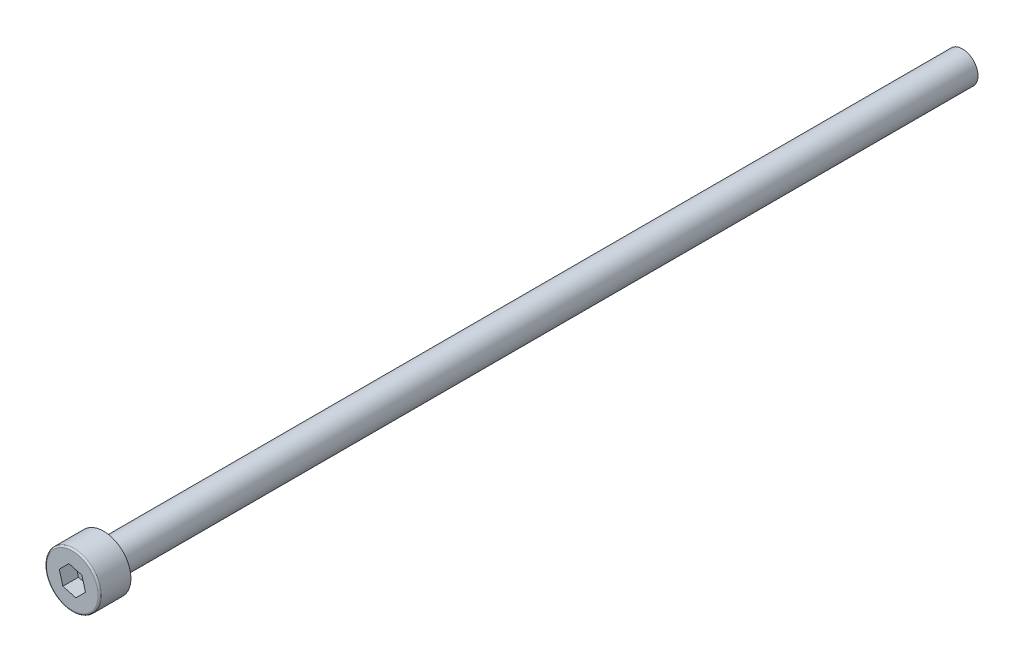
ISO-10303-21;
HEADER;
FILE_DESCRIPTION(('STEP AP214'),'2;1');
FILE_NAME('part.step','',(''),(''),'','','');
FILE_SCHEMA(('AUTOMOTIVE_DESIGN { 1 0 10303 214 1 1 1 1 }'));
ENDSEC;
DATA;
#1=APPLICATION_CONTEXT('core data for automotive mechanical design processes');
#2=APPLICATION_PROTOCOL_DEFINITION('international standard','automotive_design',2000,#1);
#3=PRODUCT_CONTEXT('',#1,'mechanical');
#4=PRODUCT('Part','Part','',(#3));
#5=PRODUCT_RELATED_PRODUCT_CATEGORY('part','',(#4));
#6=PRODUCT_DEFINITION_FORMATION('','',#4);
#7=PRODUCT_DEFINITION_CONTEXT('part definition',#1,'design');
#8=PRODUCT_DEFINITION('design','',#6,#7);
#9=PRODUCT_DEFINITION_SHAPE('','',#8);
#10=(LENGTH_UNIT() NAMED_UNIT(*) SI_UNIT(.MILLI.,.METRE.));
#11=(NAMED_UNIT(*) PLANE_ANGLE_UNIT() SI_UNIT($,.RADIAN.));
#12=(NAMED_UNIT(*) SI_UNIT($,.STERADIAN.) SOLID_ANGLE_UNIT());
#13=UNCERTAINTY_MEASURE_WITH_UNIT(LENGTH_MEASURE(1.E-05),#10,'distance_accuracy_value','');
#14=(GEOMETRIC_REPRESENTATION_CONTEXT(3) GLOBAL_UNCERTAINTY_ASSIGNED_CONTEXT((#13)) GLOBAL_UNIT_ASSIGNED_CONTEXT((#10,
#11,#12)) REPRESENTATION_CONTEXT('',''));
#15=CARTESIAN_POINT('',(0.,0.,0.));
#16=DIRECTION('',(0.,0.,1.));
#17=DIRECTION('',(1.,0.,0.));
#18=AXIS2_PLACEMENT_3D('',#15,#16,#17);
#19=CARTESIAN_POINT('',(0.,0.,0.));
#20=DIRECTION('',(0.,0.,1.));
#21=DIRECTION('',(1.,0.,0.));
#22=AXIS2_PLACEMENT_3D('',#19,#20,#21);
#23=PLANE('',#22);
#24=CARTESIAN_POINT('',(0.,0.,0.));
#25=DIRECTION('',(0.,0.,1.));
#26=DIRECTION('',(1.,0.,0.));
#27=AXIS2_PLACEMENT_3D('',#24,#25,#26);
#28=CIRCLE('',#27,3.5);
#29=CARTESIAN_POINT('',(3.5,0.,0.));
#30=VERTEX_POINT('',#29);
#31=EDGE_CURVE('E138',#30,#30,#28,.T.);
#32=ORIENTED_EDGE('',*,*,#31,.F.);
#33=EDGE_LOOP('',(#32));
#34=FACE_BOUND('',#33,.T.);
#35=CARTESIAN_POINT('',(0.,0.,0.));
#36=DIRECTION('',(0.,0.,1.));
#37=DIRECTION('',(1.,0.,0.));
#38=AXIS2_PLACEMENT_3D('',#35,#36,#37);
#39=CIRCLE('',#38,2.);
#40=CARTESIAN_POINT('',(2.,0.,0.));
#41=VERTEX_POINT('',#40);
#42=EDGE_CURVE('E146',#41,#41,#39,.F.);
#43=ORIENTED_EDGE('',*,*,#42,.F.);
#44=EDGE_LOOP('',(#43));
#45=FACE_BOUND('',#44,.T.);
#46=ADVANCED_FACE('F35',(#34,#45),#23,.F.);
#47=CARTESIAN_POINT('',(0.,0.,4.));
#48=DIRECTION('',(0.,0.,-1.));
#49=DIRECTION('',(-1.,0.,0.));
#50=AXIS2_PLACEMENT_3D('',#47,#48,#49);
#51=CYLINDRICAL_SURFACE('',#50,3.5);
#52=CARTESIAN_POINT('',(0.,0.,3.8));
#53=DIRECTION('',(0.,0.,1.));
#54=DIRECTION('',(1.,0.,0.));
#55=AXIS2_PLACEMENT_3D('',#52,#53,#54);
#56=CIRCLE('',#55,3.5);
#57=CARTESIAN_POINT('',(3.5,0.,3.8));
#58=VERTEX_POINT('',#57);
#59=EDGE_CURVE('E11',#58,#58,#56,.F.);
#60=ORIENTED_EDGE('',*,*,#59,.T.);
#61=EDGE_LOOP('',(#60));
#62=FACE_BOUND('',#61,.T.);
#63=ORIENTED_EDGE('',*,*,#31,.T.);
#64=EDGE_LOOP('',(#63));
#65=FACE_BOUND('',#64,.T.);
#66=ADVANCED_FACE('F165',(#62,#65),#51,.T.);
#67=CARTESIAN_POINT('',(0.,0.,4.));
#68=DIRECTION('',(0.,0.,1.));
#69=DIRECTION('',(1.,0.,0.));
#70=AXIS2_PLACEMENT_3D('',#67,#68,#69);
#71=PLANE('',#70);
#72=CARTESIAN_POINT('',(0.,0.,4.));
#73=DIRECTION('',(0.,0.,1.));
#74=DIRECTION('',(1.,0.,0.));
#75=AXIS2_PLACEMENT_3D('',#72,#73,#74);
#76=CIRCLE('',#75,3.3);
#77=CARTESIAN_POINT('',(3.3,0.,4.));
#78=VERTEX_POINT('',#77);
#79=EDGE_CURVE('E43',#78,#78,#76,.T.);
#80=ORIENTED_EDGE('',*,*,#79,.T.);
#81=EDGE_LOOP('',(#80));
#82=FACE_BOUND('',#81,.T.);
#83=DIRECTION('',(0.258819045102521,-0.965925826289068,0.));
#84=VECTOR('',#83,1.);
#85=CARTESIAN_POINT('',(-1.67303260747562,0.448287736084027,4.));
#86=LINE('',#85,#84);
#87=CARTESIAN_POINT('',(-1.67303260747562,0.448287736084027,4.));
#88=VERTEX_POINT('',#87);
#89=CARTESIAN_POINT('',(-1.22474487139159,-1.22474487139159,4.));
#90=VERTEX_POINT('',#89);
#91=EDGE_CURVE('E50',#88,#90,#86,.T.);
#92=ORIENTED_EDGE('',*,*,#91,.F.);
#93=DIRECTION('',(-0.707106781186547,-0.707106781186548,0.));
#94=VECTOR('',#93,1.);
#95=CARTESIAN_POINT('',(-0.448287736084027,1.67303260747562,4.));
#96=LINE('',#95,#94);
#97=CARTESIAN_POINT('',(-0.448287736084027,1.67303260747562,4.));
#98=VERTEX_POINT('',#97);
#99=EDGE_CURVE('E134',#98,#88,#96,.T.);
#100=ORIENTED_EDGE('',*,*,#99,.F.);
#101=DIRECTION('',(-0.965925826289068,0.258819045102521,0.));
#102=VECTOR('',#101,1.);
#103=CARTESIAN_POINT('',(1.22474487139159,1.22474487139159,4.));
#104=LINE('',#103,#102);
#105=CARTESIAN_POINT('',(1.22474487139159,1.22474487139159,4.));
#106=VERTEX_POINT('',#105);
#107=EDGE_CURVE('E132',#106,#98,#104,.T.);
#108=ORIENTED_EDGE('',*,*,#107,.F.);
#109=DIRECTION('',(-0.258819045102521,0.965925826289068,0.));
#110=VECTOR('',#109,1.);
#111=CARTESIAN_POINT('',(1.67303260747562,-0.448287736084027,4.));
#112=LINE('',#111,#110);
#113=CARTESIAN_POINT('',(1.67303260747562,-0.448287736084027,4.));
#114=VERTEX_POINT('',#113);
#115=EDGE_CURVE('E98',#114,#106,#112,.T.);
#116=ORIENTED_EDGE('',*,*,#115,.F.);
#117=DIRECTION('',(0.707106781186547,0.707106781186548,0.));
#118=VECTOR('',#117,1.);
#119=CARTESIAN_POINT('',(0.448287736084026,-1.67303260747562,4.));
#120=LINE('',#119,#118);
#121=CARTESIAN_POINT('',(0.448287736084026,-1.67303260747562,4.));
#122=VERTEX_POINT('',#121);
#123=EDGE_CURVE('E128',#122,#114,#120,.T.);
#124=ORIENTED_EDGE('',*,*,#123,.F.);
#125=DIRECTION('',(0.965925826289068,-0.258819045102521,0.));
#126=VECTOR('',#125,1.);
#127=CARTESIAN_POINT('',(-1.22474487139159,-1.22474487139159,4.));
#128=LINE('',#127,#126);
#129=EDGE_CURVE('E124',#90,#122,#128,.T.);
#130=ORIENTED_EDGE('',*,*,#129,.F.);
#131=EDGE_LOOP('',(#92,#100,#108,#116,#124,#130));
#132=FACE_BOUND('',#131,.T.);
#133=ADVANCED_FACE('F151',(#82,#132),#71,.T.);
#134=CARTESIAN_POINT('',(-1.67303260747562,0.448287736084027,2.));
#135=DIRECTION('',(-0.965925826289068,-0.258819045102521,0.));
#136=DIRECTION('',(0.258819045102521,-0.965925826289068,0.));
#137=AXIS2_PLACEMENT_3D('',#134,#135,#136);
#138=PLANE('',#137);
#139=ORIENTED_EDGE('',*,*,#91,.T.);
#140=DIRECTION('',(0.,0.,1.));
#141=VECTOR('',#140,1.);
#142=CARTESIAN_POINT('',(-1.22474487139159,-1.22474487139159,2.));
#143=LINE('',#142,#141);
#144=CARTESIAN_POINT('',(-1.22474487139159,-1.22474487139159,2.));
#145=VERTEX_POINT('',#144);
#146=EDGE_CURVE('E80',#145,#90,#143,.T.);
#147=ORIENTED_EDGE('',*,*,#146,.F.);
#148=DIRECTION('',(0.258819045102521,-0.965925826289068,0.));
#149=VECTOR('',#148,1.);
#150=CARTESIAN_POINT('',(-1.67303260747562,0.448287736084027,2.));
#151=LINE('',#150,#149);
#152=CARTESIAN_POINT('',(-1.67303260747562,0.448287736084027,2.));
#153=VERTEX_POINT('',#152);
#154=EDGE_CURVE('E136',#153,#145,#151,.T.);
#155=ORIENTED_EDGE('',*,*,#154,.F.);
#156=DIRECTION('',(0.,0.,1.));
#157=VECTOR('',#156,1.);
#158=CARTESIAN_POINT('',(-1.67303260747562,0.448287736084027,2.));
#159=LINE('',#158,#157);
#160=EDGE_CURVE('E58',#153,#88,#159,.T.);
#161=ORIENTED_EDGE('',*,*,#160,.T.);
#162=EDGE_LOOP('',(#139,#147,#155,#161));
#163=FACE_BOUND('',#162,.T.);
#164=ADVANCED_FACE('F177',(#163),#138,.F.);
#165=CARTESIAN_POINT('',(-0.448287736084027,1.67303260747562,2.));
#166=DIRECTION('',(-0.707106781186548,0.707106781186547,0.));
#167=DIRECTION('',(-0.707106781186547,-0.707106781186548,0.));
#168=AXIS2_PLACEMENT_3D('',#165,#166,#167);
#169=PLANE('',#168);
#170=ORIENTED_EDGE('',*,*,#99,.T.);
#171=ORIENTED_EDGE('',*,*,#160,.F.);
#172=DIRECTION('',(-0.707106781186547,-0.707106781186548,0.));
#173=VECTOR('',#172,1.);
#174=CARTESIAN_POINT('',(-0.448287736084027,1.67303260747562,2.));
#175=LINE('',#174,#173);
#176=CARTESIAN_POINT('',(-0.448287736084027,1.67303260747562,2.));
#177=VERTEX_POINT('',#176);
#178=EDGE_CURVE('E110',#177,#153,#175,.T.);
#179=ORIENTED_EDGE('',*,*,#178,.F.);
#180=DIRECTION('',(0.,0.,1.));
#181=VECTOR('',#180,1.);
#182=CARTESIAN_POINT('',(-0.448287736084027,1.67303260747562,2.));
#183=LINE('',#182,#181);
#184=EDGE_CURVE('E102',#177,#98,#183,.T.);
#185=ORIENTED_EDGE('',*,*,#184,.T.);
#186=EDGE_LOOP('',(#170,#171,#179,#185));
#187=FACE_BOUND('',#186,.T.);
#188=ADVANCED_FACE('F180',(#187),#169,.F.);
#189=CARTESIAN_POINT('',(1.22474487139159,1.22474487139159,2.));
#190=DIRECTION('',(0.258819045102521,0.965925826289068,0.));
#191=DIRECTION('',(-0.965925826289068,0.258819045102521,0.));
#192=AXIS2_PLACEMENT_3D('',#189,#190,#191);
#193=PLANE('',#192);
#194=ORIENTED_EDGE('',*,*,#107,.T.);
#195=ORIENTED_EDGE('',*,*,#184,.F.);
#196=DIRECTION('',(-0.965925826289068,0.258819045102521,0.));
#197=VECTOR('',#196,1.);
#198=CARTESIAN_POINT('',(1.22474487139159,1.22474487139159,2.));
#199=LINE('',#198,#197);
#200=CARTESIAN_POINT('',(1.22474487139159,1.22474487139159,2.));
#201=VERTEX_POINT('',#200);
#202=EDGE_CURVE('E106',#201,#177,#199,.T.);
#203=ORIENTED_EDGE('',*,*,#202,.F.);
#204=DIRECTION('',(0.,0.,1.));
#205=VECTOR('',#204,1.);
#206=CARTESIAN_POINT('',(1.22474487139159,1.22474487139159,2.));
#207=LINE('',#206,#205);
#208=EDGE_CURVE('E91',#201,#106,#207,.T.);
#209=ORIENTED_EDGE('',*,*,#208,.T.);
#210=EDGE_LOOP('',(#194,#195,#203,#209));
#211=FACE_BOUND('',#210,.T.);
#212=ADVANCED_FACE('F107',(#211),#193,.F.);
#213=CARTESIAN_POINT('',(1.67303260747562,-0.448287736084027,2.));
#214=DIRECTION('',(0.965925826289068,0.258819045102521,0.));
#215=DIRECTION('',(-0.258819045102521,0.965925826289068,0.));
#216=AXIS2_PLACEMENT_3D('',#213,#214,#215);
#217=PLANE('',#216);
#218=ORIENTED_EDGE('',*,*,#115,.T.);
#219=ORIENTED_EDGE('',*,*,#208,.F.);
#220=DIRECTION('',(-0.258819045102521,0.965925826289068,0.));
#221=VECTOR('',#220,1.);
#222=CARTESIAN_POINT('',(1.67303260747562,-0.448287736084027,2.));
#223=LINE('',#222,#221);
#224=CARTESIAN_POINT('',(1.67303260747562,-0.448287736084027,2.));
#225=VERTEX_POINT('',#224);
#226=EDGE_CURVE('E95',#225,#201,#223,.T.);
#227=ORIENTED_EDGE('',*,*,#226,.F.);
#228=DIRECTION('',(0.,0.,1.));
#229=VECTOR('',#228,1.);
#230=CARTESIAN_POINT('',(1.67303260747562,-0.448287736084027,2.));
#231=LINE('',#230,#229);
#232=EDGE_CURVE('E103',#225,#114,#231,.T.);
#233=ORIENTED_EDGE('',*,*,#232,.T.);
#234=EDGE_LOOP('',(#218,#219,#227,#233));
#235=FACE_BOUND('',#234,.T.);
#236=ADVANCED_FACE('F93',(#235),#217,.F.);
#237=CARTESIAN_POINT('',(0.448287736084026,-1.67303260747562,2.));
#238=DIRECTION('',(0.707106781186548,-0.707106781186547,0.));
#239=DIRECTION('',(0.707106781186547,0.707106781186548,0.));
#240=AXIS2_PLACEMENT_3D('',#237,#238,#239);
#241=PLANE('',#240);
#242=ORIENTED_EDGE('',*,*,#123,.T.);
#243=ORIENTED_EDGE('',*,*,#232,.F.);
#244=DIRECTION('',(0.707106781186547,0.707106781186548,0.));
#245=VECTOR('',#244,1.);
#246=CARTESIAN_POINT('',(0.448287736084026,-1.67303260747562,2.));
#247=LINE('',#246,#245);
#248=CARTESIAN_POINT('',(0.448287736084026,-1.67303260747562,2.));
#249=VERTEX_POINT('',#248);
#250=EDGE_CURVE('E116',#249,#225,#247,.T.);
#251=ORIENTED_EDGE('',*,*,#250,.F.);
#252=DIRECTION('',(0.,0.,1.));
#253=VECTOR('',#252,1.);
#254=CARTESIAN_POINT('',(0.448287736084026,-1.67303260747562,2.));
#255=LINE('',#254,#253);
#256=EDGE_CURVE('E141',#249,#122,#255,.T.);
#257=ORIENTED_EDGE('',*,*,#256,.T.);
#258=EDGE_LOOP('',(#242,#243,#251,#257));
#259=FACE_BOUND('',#258,.T.);
#260=ADVANCED_FACE('F184',(#259),#241,.F.);
#261=CARTESIAN_POINT('',(-1.22474487139159,-1.22474487139159,2.));
#262=DIRECTION('',(-0.258819045102521,-0.965925826289068,0.));
#263=DIRECTION('',(0.965925826289068,-0.258819045102521,0.));
#264=AXIS2_PLACEMENT_3D('',#261,#262,#263);
#265=PLANE('',#264);
#266=ORIENTED_EDGE('',*,*,#129,.T.);
#267=ORIENTED_EDGE('',*,*,#256,.F.);
#268=DIRECTION('',(0.965925826289068,-0.258819045102521,0.));
#269=VECTOR('',#268,1.);
#270=CARTESIAN_POINT('',(-1.22474487139159,-1.22474487139159,2.));
#271=LINE('',#270,#269);
#272=EDGE_CURVE('E118',#145,#249,#271,.T.);
#273=ORIENTED_EDGE('',*,*,#272,.F.);
#274=ORIENTED_EDGE('',*,*,#146,.T.);
#275=EDGE_LOOP('',(#266,#267,#273,#274));
#276=FACE_BOUND('',#275,.T.);
#277=ADVANCED_FACE('F181',(#276),#265,.F.);
#278=CARTESIAN_POINT('',(0.,0.,2.));
#279=DIRECTION('',(0.,0.,1.));
#280=DIRECTION('',(1.,0.,0.));
#281=AXIS2_PLACEMENT_3D('',#278,#279,#280);
#282=PLANE('',#281);
#283=ORIENTED_EDGE('',*,*,#154,.T.);
#284=ORIENTED_EDGE('',*,*,#272,.T.);
#285=ORIENTED_EDGE('',*,*,#250,.T.);
#286=ORIENTED_EDGE('',*,*,#226,.T.);
#287=ORIENTED_EDGE('',*,*,#202,.T.);
#288=ORIENTED_EDGE('',*,*,#178,.T.);
#289=EDGE_LOOP('',(#283,#284,#285,#286,#287,#288));
#290=FACE_BOUND('',#289,.T.);
#291=ADVANCED_FACE('F113',(#290),#282,.T.);
#292=CARTESIAN_POINT('',(0.,0.,-110.));
#293=DIRECTION('',(0.,0.,1.));
#294=DIRECTION('',(1.,0.,0.));
#295=AXIS2_PLACEMENT_3D('',#292,#293,#294);
#296=CYLINDRICAL_SURFACE('',#295,2.);
#297=CARTESIAN_POINT('',(0.,0.,-110.));
#298=DIRECTION('',(0.,0.,-1.));
#299=DIRECTION('',(-1.,0.,0.));
#300=AXIS2_PLACEMENT_3D('',#297,#298,#299);
#301=CIRCLE('',#300,2.);
#302=CARTESIAN_POINT('',(-2.,0.,-110.));
#303=VERTEX_POINT('',#302);
#304=EDGE_CURVE('E125',#303,#303,#301,.T.);
#305=ORIENTED_EDGE('',*,*,#304,.F.);
#306=EDGE_LOOP('',(#305));
#307=FACE_BOUND('',#306,.T.);
#308=ORIENTED_EDGE('',*,*,#42,.T.);
#309=EDGE_LOOP('',(#308));
#310=FACE_BOUND('',#309,.T.);
#311=ADVANCED_FACE('F160',(#307,#310),#296,.T.);
#312=CARTESIAN_POINT('',(0.,0.,-110.));
#313=DIRECTION('',(0.,0.,-1.));
#314=DIRECTION('',(-1.,0.,0.));
#315=AXIS2_PLACEMENT_3D('',#312,#313,#314);
#316=PLANE('',#315);
#317=ORIENTED_EDGE('',*,*,#304,.T.);
#318=EDGE_LOOP('',(#317));
#319=FACE_BOUND('',#318,.T.);
#320=ADVANCED_FACE('F155',(#319),#316,.T.);
#321=CARTESIAN_POINT('',(0.,0.,3.8));
#322=DIRECTION('',(0.,0.,1.));
#323=DIRECTION('',(1.,0.,0.));
#324=AXIS2_PLACEMENT_3D('',#321,#322,#323);
#325=TOROIDAL_SURFACE('',#324,3.3,0.2);
#326=ORIENTED_EDGE('',*,*,#59,.F.);
#327=EDGE_LOOP('',(#326));
#328=FACE_BOUND('',#327,.T.);
#329=ORIENTED_EDGE('',*,*,#79,.F.);
#330=EDGE_LOOP('',(#329));
#331=FACE_BOUND('',#330,.T.);
#332=ADVANCED_FACE('F37',(#328,#331),#325,.T.);
#333=CLOSED_SHELL('',(#46,#66,#133,#164,#188,#212,#236,#260,#277,#291,#311,#320,#332));
#334=MANIFOLD_SOLID_BREP('B2',#333);
#335=ADVANCED_BREP_SHAPE_REPRESENTATION('',(#18,#334),#14);
#336=SHAPE_DEFINITION_REPRESENTATION(#9,#335);
ENDSEC;
END-ISO-10303-21;
